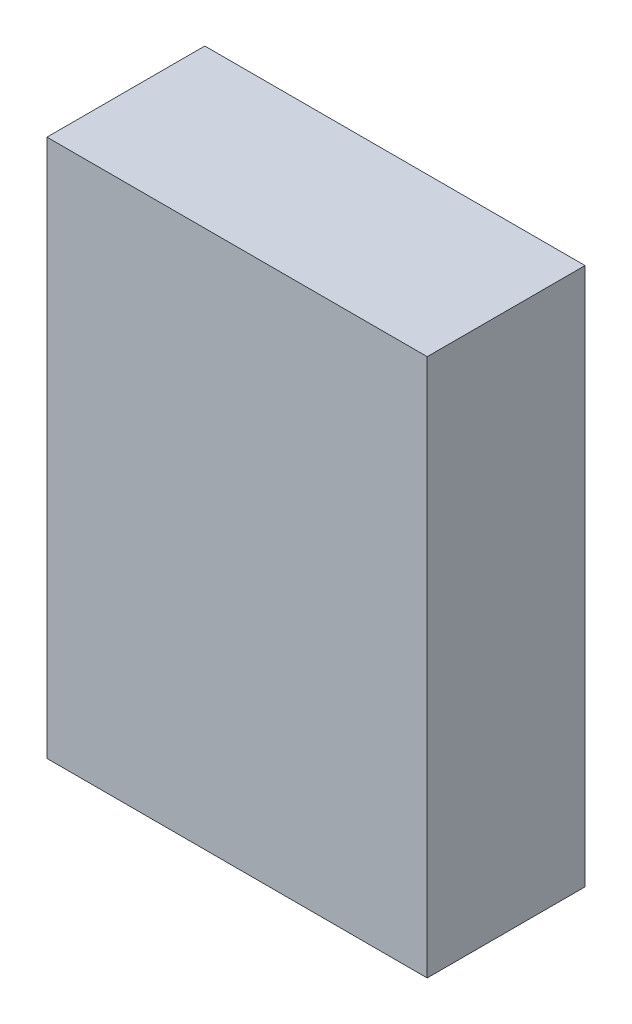
ISO-10303-21;
HEADER;
FILE_DESCRIPTION(('STEP AP214'),'2;1');
FILE_NAME('part.step','',(''),(''),'','','');
FILE_SCHEMA(('AUTOMOTIVE_DESIGN { 1 0 10303 214 1 1 1 1 }'));
ENDSEC;
DATA;
#1=APPLICATION_CONTEXT('core data for automotive mechanical design processes');
#2=APPLICATION_PROTOCOL_DEFINITION('international standard','automotive_design',2000,#1);
#3=PRODUCT_CONTEXT('',#1,'mechanical');
#4=PRODUCT('Part','Part','',(#3));
#5=PRODUCT_RELATED_PRODUCT_CATEGORY('part','',(#4));
#6=PRODUCT_DEFINITION_FORMATION('','',#4);
#7=PRODUCT_DEFINITION_CONTEXT('part definition',#1,'design');
#8=PRODUCT_DEFINITION('design','',#6,#7);
#9=PRODUCT_DEFINITION_SHAPE('','',#8);
#10=(LENGTH_UNIT() NAMED_UNIT(*) SI_UNIT(.MILLI.,.METRE.));
#11=(NAMED_UNIT(*) PLANE_ANGLE_UNIT() SI_UNIT($,.RADIAN.));
#12=(NAMED_UNIT(*) SI_UNIT($,.STERADIAN.) SOLID_ANGLE_UNIT());
#13=UNCERTAINTY_MEASURE_WITH_UNIT(LENGTH_MEASURE(1.E-05),#10,'distance_accuracy_value','');
#14=(GEOMETRIC_REPRESENTATION_CONTEXT(3) GLOBAL_UNCERTAINTY_ASSIGNED_CONTEXT((#13)) GLOBAL_UNIT_ASSIGNED_CONTEXT((#10,
#11,#12)) REPRESENTATION_CONTEXT('',''));
#15=CARTESIAN_POINT('',(0.,0.,0.));
#16=DIRECTION('',(0.,0.,1.));
#17=DIRECTION('',(1.,0.,0.));
#18=AXIS2_PLACEMENT_3D('',#15,#16,#17);
#19=CARTESIAN_POINT('',(26.5,-37.5,22.));
#20=DIRECTION('',(-1.,0.,0.));
#21=DIRECTION('',(0.,0.,1.));
#22=AXIS2_PLACEMENT_3D('',#19,#20,#21);
#23=PLANE('',#22);
#24=DIRECTION('',(0.,1.,0.));
#25=VECTOR('',#24,1.);
#26=CARTESIAN_POINT('',(26.5,-37.5,0.));
#27=LINE('',#26,#25);
#28=CARTESIAN_POINT('',(26.5,-37.5,0.));
#29=VERTEX_POINT('',#28);
#30=CARTESIAN_POINT('',(26.5,37.5,0.));
#31=VERTEX_POINT('',#30);
#32=EDGE_CURVE('E112',#29,#31,#27,.T.);
#33=ORIENTED_EDGE('',*,*,#32,.T.);
#34=DIRECTION('',(0.,0.,-1.));
#35=VECTOR('',#34,1.);
#36=CARTESIAN_POINT('',(26.5,37.5,22.));
#37=LINE('',#36,#35);
#38=CARTESIAN_POINT('',(26.5,37.5,22.));
#39=VERTEX_POINT('',#38);
#40=EDGE_CURVE('E11',#39,#31,#37,.T.);
#41=ORIENTED_EDGE('',*,*,#40,.F.);
#42=DIRECTION('',(0.,1.,0.));
#43=VECTOR('',#42,1.);
#44=CARTESIAN_POINT('',(26.5,-37.5,22.));
#45=LINE('',#44,#43);
#46=CARTESIAN_POINT('',(26.5,-37.5,22.));
#47=VERTEX_POINT('',#46);
#48=EDGE_CURVE('E95',#47,#39,#45,.T.);
#49=ORIENTED_EDGE('',*,*,#48,.F.);
#50=DIRECTION('',(0.,0.,-1.));
#51=VECTOR('',#50,1.);
#52=CARTESIAN_POINT('',(26.5,-37.5,22.));
#53=LINE('',#52,#51);
#54=EDGE_CURVE('E108',#47,#29,#53,.T.);
#55=ORIENTED_EDGE('',*,*,#54,.T.);
#56=EDGE_LOOP('',(#33,#41,#49,#55));
#57=FACE_BOUND('',#56,.T.);
#58=ADVANCED_FACE('F43',(#57),#23,.F.);
#59=CARTESIAN_POINT('',(-26.5,37.5,22.));
#60=DIRECTION('',(0.,-1.,0.));
#61=DIRECTION('',(0.,0.,-1.));
#62=AXIS2_PLACEMENT_3D('',#59,#60,#61);
#63=PLANE('',#62);
#64=DIRECTION('',(-1.,0.,0.));
#65=VECTOR('',#64,1.);
#66=CARTESIAN_POINT('',(-26.5,37.5,0.));
#67=LINE('',#66,#65);
#68=CARTESIAN_POINT('',(-26.5,37.5,0.));
#69=VERTEX_POINT('',#68);
#70=EDGE_CURVE('E100',#31,#69,#67,.T.);
#71=ORIENTED_EDGE('',*,*,#70,.T.);
#72=DIRECTION('',(0.,0.,-1.));
#73=VECTOR('',#72,1.);
#74=CARTESIAN_POINT('',(-26.5,37.5,22.));
#75=LINE('',#74,#73);
#76=CARTESIAN_POINT('',(-26.5,37.5,22.));
#77=VERTEX_POINT('',#76);
#78=EDGE_CURVE('E52',#77,#69,#75,.T.);
#79=ORIENTED_EDGE('',*,*,#78,.F.);
#80=DIRECTION('',(-1.,0.,0.));
#81=VECTOR('',#80,1.);
#82=CARTESIAN_POINT('',(-26.5,37.5,22.));
#83=LINE('',#82,#81);
#84=EDGE_CURVE('E90',#39,#77,#83,.T.);
#85=ORIENTED_EDGE('',*,*,#84,.F.);
#86=ORIENTED_EDGE('',*,*,#40,.T.);
#87=EDGE_LOOP('',(#71,#79,#85,#86));
#88=FACE_BOUND('',#87,.T.);
#89=ADVANCED_FACE('F99',(#88),#63,.F.);
#90=CARTESIAN_POINT('',(-26.5,-37.5,22.));
#91=DIRECTION('',(1.,0.,0.));
#92=DIRECTION('',(0.,0.,-1.));
#93=AXIS2_PLACEMENT_3D('',#90,#91,#92);
#94=PLANE('',#93);
#95=DIRECTION('',(0.,-1.,0.));
#96=VECTOR('',#95,1.);
#97=CARTESIAN_POINT('',(-26.5,-37.5,0.));
#98=LINE('',#97,#96);
#99=CARTESIAN_POINT('',(-26.5,-37.5,0.));
#100=VERTEX_POINT('',#99);
#101=EDGE_CURVE('E77',#69,#100,#98,.T.);
#102=ORIENTED_EDGE('',*,*,#101,.T.);
#103=DIRECTION('',(0.,0.,-1.));
#104=VECTOR('',#103,1.);
#105=CARTESIAN_POINT('',(-26.5,-37.5,22.));
#106=LINE('',#105,#104);
#107=CARTESIAN_POINT('',(-26.5,-37.5,22.));
#108=VERTEX_POINT('',#107);
#109=EDGE_CURVE('E102',#108,#100,#106,.T.);
#110=ORIENTED_EDGE('',*,*,#109,.F.);
#111=DIRECTION('',(0.,-1.,0.));
#112=VECTOR('',#111,1.);
#113=CARTESIAN_POINT('',(-26.5,-37.5,22.));
#114=LINE('',#113,#112);
#115=EDGE_CURVE('E93',#77,#108,#114,.T.);
#116=ORIENTED_EDGE('',*,*,#115,.F.);
#117=ORIENTED_EDGE('',*,*,#78,.T.);
#118=EDGE_LOOP('',(#102,#110,#116,#117));
#119=FACE_BOUND('',#118,.T.);
#120=ADVANCED_FACE('F103',(#119),#94,.F.);
#121=CARTESIAN_POINT('',(-26.5,-37.5,22.));
#122=DIRECTION('',(0.,1.,0.));
#123=DIRECTION('',(0.,0.,1.));
#124=AXIS2_PLACEMENT_3D('',#121,#122,#123);
#125=PLANE('',#124);
#126=DIRECTION('',(1.,0.,0.));
#127=VECTOR('',#126,1.);
#128=CARTESIAN_POINT('',(-26.5,-37.5,0.));
#129=LINE('',#128,#127);
#130=EDGE_CURVE('E83',#100,#29,#129,.T.);
#131=ORIENTED_EDGE('',*,*,#130,.T.);
#132=ORIENTED_EDGE('',*,*,#54,.F.);
#133=DIRECTION('',(1.,0.,0.));
#134=VECTOR('',#133,1.);
#135=CARTESIAN_POINT('',(-26.5,-37.5,22.));
#136=LINE('',#135,#134);
#137=EDGE_CURVE('E60',#108,#47,#136,.T.);
#138=ORIENTED_EDGE('',*,*,#137,.F.);
#139=ORIENTED_EDGE('',*,*,#109,.T.);
#140=EDGE_LOOP('',(#131,#132,#138,#139));
#141=FACE_BOUND('',#140,.T.);
#142=ADVANCED_FACE('F124',(#141),#125,.F.);
#143=CARTESIAN_POINT('',(0.,0.,22.));
#144=DIRECTION('',(0.,0.,-1.));
#145=DIRECTION('',(-1.,0.,0.));
#146=AXIS2_PLACEMENT_3D('',#143,#144,#145);
#147=PLANE('',#146);
#148=ORIENTED_EDGE('',*,*,#48,.T.);
#149=ORIENTED_EDGE('',*,*,#84,.T.);
#150=ORIENTED_EDGE('',*,*,#115,.T.);
#151=ORIENTED_EDGE('',*,*,#137,.T.);
#152=EDGE_LOOP('',(#148,#149,#150,#151));
#153=FACE_BOUND('',#152,.T.);
#154=ADVANCED_FACE('F91',(#153),#147,.F.);
#155=CARTESIAN_POINT('',(0.,0.,0.));
#156=DIRECTION('',(0.,0.,-1.));
#157=DIRECTION('',(-1.,0.,0.));
#158=AXIS2_PLACEMENT_3D('',#155,#156,#157);
#159=PLANE('',#158);
#160=ORIENTED_EDGE('',*,*,#32,.F.);
#161=ORIENTED_EDGE('',*,*,#130,.F.);
#162=ORIENTED_EDGE('',*,*,#101,.F.);
#163=ORIENTED_EDGE('',*,*,#70,.F.);
#164=EDGE_LOOP('',(#160,#161,#162,#163));
#165=FACE_BOUND('',#164,.T.);
#166=ADVANCED_FACE('F127',(#165),#159,.T.);
#167=CLOSED_SHELL('',(#58,#89,#120,#142,#154,#166));
#168=MANIFOLD_SOLID_BREP('B2',#167);
#169=ADVANCED_BREP_SHAPE_REPRESENTATION('',(#18,#168),#14);
#170=SHAPE_DEFINITION_REPRESENTATION(#9,#169);
ENDSEC;
END-ISO-10303-21;
